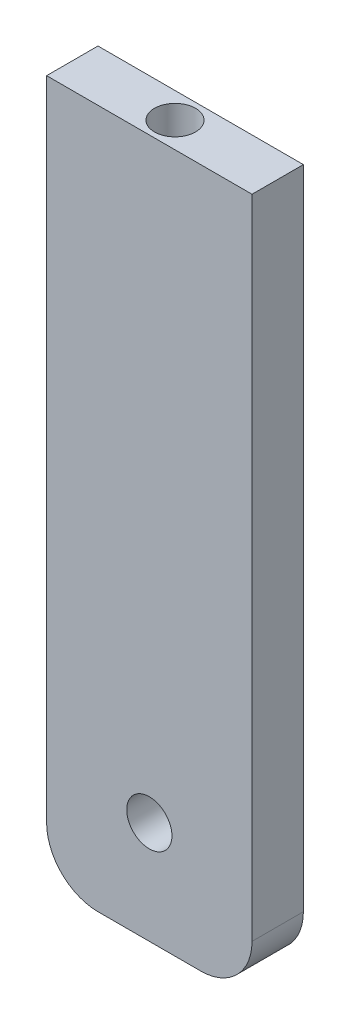
ISO-10303-21;
HEADER;
FILE_DESCRIPTION(('STEP AP214'),'2;1');
FILE_NAME('part.step','',(''),(''),'','','');
FILE_SCHEMA(('AUTOMOTIVE_DESIGN { 1 0 10303 214 1 1 1 1 }'));
ENDSEC;
DATA;
#1=APPLICATION_CONTEXT('core data for automotive mechanical design processes');
#2=APPLICATION_PROTOCOL_DEFINITION('international standard','automotive_design',2000,#1);
#3=PRODUCT_CONTEXT('',#1,'mechanical');
#4=PRODUCT('Part','Part','',(#3));
#5=PRODUCT_RELATED_PRODUCT_CATEGORY('part','',(#4));
#6=PRODUCT_DEFINITION_FORMATION('','',#4);
#7=PRODUCT_DEFINITION_CONTEXT('part definition',#1,'design');
#8=PRODUCT_DEFINITION('design','',#6,#7);
#9=PRODUCT_DEFINITION_SHAPE('','',#8);
#10=(LENGTH_UNIT() NAMED_UNIT(*) SI_UNIT(.MILLI.,.METRE.));
#11=(NAMED_UNIT(*) PLANE_ANGLE_UNIT() SI_UNIT($,.RADIAN.));
#12=(NAMED_UNIT(*) SI_UNIT($,.STERADIAN.) SOLID_ANGLE_UNIT());
#13=UNCERTAINTY_MEASURE_WITH_UNIT(LENGTH_MEASURE(1.E-05),#10,'distance_accuracy_value','');
#14=(GEOMETRIC_REPRESENTATION_CONTEXT(3) GLOBAL_UNCERTAINTY_ASSIGNED_CONTEXT((#13)) GLOBAL_UNIT_ASSIGNED_CONTEXT((#10,
#11,#12)) REPRESENTATION_CONTEXT('',''));
#15=CARTESIAN_POINT('',(0.,0.,0.));
#16=DIRECTION('',(0.,0.,1.));
#17=DIRECTION('',(1.,0.,0.));
#18=AXIS2_PLACEMENT_3D('',#15,#16,#17);
#19=CARTESIAN_POINT('',(0.,0.,5.));
#20=DIRECTION('',(0.,0.,-1.));
#21=DIRECTION('',(-1.,0.,0.));
#22=AXIS2_PLACEMENT_3D('',#19,#20,#21);
#23=PLANE('',#22);
#24=DIRECTION('',(0.,-1.,0.));
#25=VECTOR('',#24,1.);
#26=CARTESIAN_POINT('',(0.,0.,5.));
#27=LINE('',#26,#25);
#28=CARTESIAN_POINT('',(0.,68.,5.));
#29=VERTEX_POINT('',#28);
#30=CARTESIAN_POINT('',(0.,5.,5.));
#31=VERTEX_POINT('',#30);
#32=EDGE_CURVE('E124',#29,#31,#27,.T.);
#33=ORIENTED_EDGE('',*,*,#32,.T.);
#34=CARTESIAN_POINT('',(5.,5.,5.));
#35=DIRECTION('',(0.,0.,-1.));
#36=DIRECTION('',(-1.,0.,0.));
#37=AXIS2_PLACEMENT_3D('',#34,#35,#36);
#38=CIRCLE('',#37,5.);
#39=CARTESIAN_POINT('',(5.,0.,5.));
#40=VERTEX_POINT('',#39);
#41=EDGE_CURVE('E45',#31,#40,#38,.F.);
#42=ORIENTED_EDGE('',*,*,#41,.T.);
#43=DIRECTION('',(1.,0.,0.));
#44=VECTOR('',#43,1.);
#45=CARTESIAN_POINT('',(0.,0.,5.));
#46=LINE('',#45,#44);
#47=CARTESIAN_POINT('',(15.,0.,5.));
#48=VERTEX_POINT('',#47);
#49=EDGE_CURVE('E98',#40,#48,#46,.T.);
#50=ORIENTED_EDGE('',*,*,#49,.T.);
#51=CARTESIAN_POINT('',(15.,5.,5.));
#52=DIRECTION('',(0.,0.,-1.));
#53=DIRECTION('',(-1.,0.,0.));
#54=AXIS2_PLACEMENT_3D('',#51,#52,#53);
#55=CIRCLE('',#54,5.);
#56=CARTESIAN_POINT('',(20.,5.,5.));
#57=VERTEX_POINT('',#56);
#58=EDGE_CURVE('E52',#48,#57,#55,.F.);
#59=ORIENTED_EDGE('',*,*,#58,.T.);
#60=DIRECTION('',(0.,1.,0.));
#61=VECTOR('',#60,1.);
#62=CARTESIAN_POINT('',(20.,68.,5.));
#63=LINE('',#62,#61);
#64=CARTESIAN_POINT('',(20.,68.,5.));
#65=VERTEX_POINT('',#64);
#66=EDGE_CURVE('E90',#57,#65,#63,.T.);
#67=ORIENTED_EDGE('',*,*,#66,.T.);
#68=DIRECTION('',(-1.,0.,0.));
#69=VECTOR('',#68,1.);
#70=CARTESIAN_POINT('',(0.,68.,5.));
#71=LINE('',#70,#69);
#72=EDGE_CURVE('E94',#65,#29,#71,.T.);
#73=ORIENTED_EDGE('',*,*,#72,.T.);
#74=EDGE_LOOP('',(#33,#42,#50,#59,#67,#73));
#75=FACE_BOUND('',#74,.T.);
#76=CARTESIAN_POINT('',(10.,10.,5.));
#77=DIRECTION('',(0.,0.,1.));
#78=DIRECTION('',(1.,0.,0.));
#79=AXIS2_PLACEMENT_3D('',#76,#77,#78);
#80=CIRCLE('',#79,2.2);
#81=CARTESIAN_POINT('',(12.2,10.,5.));
#82=VERTEX_POINT('',#81);
#83=EDGE_CURVE('E119',#82,#82,#80,.T.);
#84=ORIENTED_EDGE('',*,*,#83,.F.);
#85=EDGE_LOOP('',(#84));
#86=FACE_BOUND('',#85,.T.);
#87=ADVANCED_FACE('F37',(#75,#86),#23,.F.);
#88=CARTESIAN_POINT('',(0.,0.,0.));
#89=DIRECTION('',(0.,0.,-1.));
#90=DIRECTION('',(-1.,0.,0.));
#91=AXIS2_PLACEMENT_3D('',#88,#89,#90);
#92=PLANE('',#91);
#93=DIRECTION('',(1.,0.,0.));
#94=VECTOR('',#93,1.);
#95=CARTESIAN_POINT('',(0.,0.,0.));
#96=LINE('',#95,#94);
#97=CARTESIAN_POINT('',(5.,0.,0.));
#98=VERTEX_POINT('',#97);
#99=CARTESIAN_POINT('',(15.,0.,0.));
#100=VERTEX_POINT('',#99);
#101=EDGE_CURVE('E118',#98,#100,#96,.T.);
#102=ORIENTED_EDGE('',*,*,#101,.F.);
#103=CARTESIAN_POINT('',(5.,5.,0.));
#104=DIRECTION('',(0.,0.,-1.));
#105=DIRECTION('',(-1.,0.,0.));
#106=AXIS2_PLACEMENT_3D('',#103,#104,#105);
#107=CIRCLE('',#106,5.);
#108=CARTESIAN_POINT('',(0.,5.,0.));
#109=VERTEX_POINT('',#108);
#110=EDGE_CURVE('E132',#98,#109,#107,.T.);
#111=ORIENTED_EDGE('',*,*,#110,.T.);
#112=DIRECTION('',(0.,-1.,0.));
#113=VECTOR('',#112,1.);
#114=CARTESIAN_POINT('',(0.,0.,0.));
#115=LINE('',#114,#113);
#116=CARTESIAN_POINT('',(0.,68.,0.));
#117=VERTEX_POINT('',#116);
#118=EDGE_CURVE('E116',#117,#109,#115,.T.);
#119=ORIENTED_EDGE('',*,*,#118,.F.);
#120=DIRECTION('',(-1.,0.,0.));
#121=VECTOR('',#120,1.);
#122=CARTESIAN_POINT('',(0.,68.,0.));
#123=LINE('',#122,#121);
#124=CARTESIAN_POINT('',(20.,68.,0.));
#125=VERTEX_POINT('',#124);
#126=EDGE_CURVE('E123',#125,#117,#123,.T.);
#127=ORIENTED_EDGE('',*,*,#126,.F.);
#128=DIRECTION('',(0.,1.,0.));
#129=VECTOR('',#128,1.);
#130=CARTESIAN_POINT('',(20.,68.,0.));
#131=LINE('',#130,#129);
#132=CARTESIAN_POINT('',(20.,5.,0.));
#133=VERTEX_POINT('',#132);
#134=EDGE_CURVE('E104',#133,#125,#131,.T.);
#135=ORIENTED_EDGE('',*,*,#134,.F.);
#136=CARTESIAN_POINT('',(15.,5.,0.));
#137=DIRECTION('',(0.,0.,-1.));
#138=DIRECTION('',(-1.,0.,0.));
#139=AXIS2_PLACEMENT_3D('',#136,#137,#138);
#140=CIRCLE('',#139,5.);
#141=EDGE_CURVE('E130',#133,#100,#140,.T.);
#142=ORIENTED_EDGE('',*,*,#141,.T.);
#143=EDGE_LOOP('',(#102,#111,#119,#127,#135,#142));
#144=FACE_BOUND('',#143,.T.);
#145=CARTESIAN_POINT('',(10.,10.,0.));
#146=DIRECTION('',(0.,0.,1.));
#147=DIRECTION('',(1.,0.,0.));
#148=AXIS2_PLACEMENT_3D('',#145,#146,#147);
#149=CIRCLE('',#148,2.2);
#150=CARTESIAN_POINT('',(12.2,10.,0.));
#151=VERTEX_POINT('',#150);
#152=EDGE_CURVE('E151',#151,#151,#149,.T.);
#153=ORIENTED_EDGE('',*,*,#152,.T.);
#154=EDGE_LOOP('',(#153));
#155=FACE_BOUND('',#154,.T.);
#156=ADVANCED_FACE('F146',(#144,#155),#92,.T.);
#157=CARTESIAN_POINT('',(0.,0.,5.));
#158=DIRECTION('',(1.,0.,0.));
#159=DIRECTION('',(0.,0.,-1.));
#160=AXIS2_PLACEMENT_3D('',#157,#158,#159);
#161=PLANE('',#160);
#162=ORIENTED_EDGE('',*,*,#118,.T.);
#163=DIRECTION('',(0.,0.,-1.));
#164=VECTOR('',#163,1.);
#165=CARTESIAN_POINT('',(0.,5.,5.));
#166=LINE('',#165,#164);
#167=EDGE_CURVE('E60',#109,#31,#166,.F.);
#168=ORIENTED_EDGE('',*,*,#167,.T.);
#169=ORIENTED_EDGE('',*,*,#32,.F.);
#170=DIRECTION('',(0.,0.,-1.));
#171=VECTOR('',#170,1.);
#172=CARTESIAN_POINT('',(0.,68.,5.));
#173=LINE('',#172,#171);
#174=EDGE_CURVE('E108',#29,#117,#173,.T.);
#175=ORIENTED_EDGE('',*,*,#174,.T.);
#176=EDGE_LOOP('',(#162,#168,#169,#175));
#177=FACE_BOUND('',#176,.T.);
#178=ADVANCED_FACE('F148',(#177),#161,.F.);
#179=CARTESIAN_POINT('',(0.,0.,5.));
#180=DIRECTION('',(0.,1.,0.));
#181=DIRECTION('',(0.,0.,1.));
#182=AXIS2_PLACEMENT_3D('',#179,#180,#181);
#183=PLANE('',#182);
#184=ORIENTED_EDGE('',*,*,#49,.F.);
#185=DIRECTION('',(0.,0.,-1.));
#186=VECTOR('',#185,1.);
#187=CARTESIAN_POINT('',(5.,0.,5.));
#188=LINE('',#187,#186);
#189=EDGE_CURVE('E127',#40,#98,#188,.T.);
#190=ORIENTED_EDGE('',*,*,#189,.T.);
#191=ORIENTED_EDGE('',*,*,#101,.T.);
#192=DIRECTION('',(0.,0.,-1.));
#193=VECTOR('',#192,1.);
#194=CARTESIAN_POINT('',(15.,0.,5.));
#195=LINE('',#194,#193);
#196=EDGE_CURVE('E107',#100,#48,#195,.F.);
#197=ORIENTED_EDGE('',*,*,#196,.T.);
#198=EDGE_LOOP('',(#184,#190,#191,#197));
#199=FACE_BOUND('',#198,.T.);
#200=ADVANCED_FACE('F140',(#199),#183,.F.);
#201=CARTESIAN_POINT('',(20.,68.,5.));
#202=DIRECTION('',(-1.,0.,0.));
#203=DIRECTION('',(0.,0.,1.));
#204=AXIS2_PLACEMENT_3D('',#201,#202,#203);
#205=PLANE('',#204);
#206=ORIENTED_EDGE('',*,*,#66,.F.);
#207=DIRECTION('',(0.,0.,-1.));
#208=VECTOR('',#207,1.);
#209=CARTESIAN_POINT('',(20.,5.,5.));
#210=LINE('',#209,#208);
#211=EDGE_CURVE('E11',#57,#133,#210,.T.);
#212=ORIENTED_EDGE('',*,*,#211,.T.);
#213=ORIENTED_EDGE('',*,*,#134,.T.);
#214=DIRECTION('',(0.,0.,-1.));
#215=VECTOR('',#214,1.);
#216=CARTESIAN_POINT('',(20.,68.,5.));
#217=LINE('',#216,#215);
#218=EDGE_CURVE('E101',#65,#125,#217,.T.);
#219=ORIENTED_EDGE('',*,*,#218,.F.);
#220=EDGE_LOOP('',(#206,#212,#213,#219));
#221=FACE_BOUND('',#220,.T.);
#222=ADVANCED_FACE('F102',(#221),#205,.F.);
#223=CARTESIAN_POINT('',(0.,68.,5.));
#224=DIRECTION('',(0.,-1.,0.));
#225=DIRECTION('',(0.,0.,-1.));
#226=AXIS2_PLACEMENT_3D('',#223,#224,#225);
#227=PLANE('',#226);
#228=CARTESIAN_POINT('',(10.,68.,2.5));
#229=DIRECTION('',(0.,1.,0.));
#230=DIRECTION('',(0.,0.,1.));
#231=AXIS2_PLACEMENT_3D('',#228,#229,#230);
#232=CIRCLE('',#231,2.);
#233=CARTESIAN_POINT('',(10.,68.,4.5));
#234=VERTEX_POINT('',#233);
#235=EDGE_CURVE('E157',#234,#234,#232,.T.);
#236=ORIENTED_EDGE('',*,*,#235,.F.);
#237=EDGE_LOOP('',(#236));
#238=FACE_BOUND('',#237,.T.);
#239=ORIENTED_EDGE('',*,*,#126,.T.);
#240=ORIENTED_EDGE('',*,*,#174,.F.);
#241=ORIENTED_EDGE('',*,*,#72,.F.);
#242=ORIENTED_EDGE('',*,*,#218,.T.);
#243=EDGE_LOOP('',(#239,#240,#241,#242));
#244=FACE_BOUND('',#243,.T.);
#245=ADVANCED_FACE('F110',(#238,#244),#227,.F.);
#246=CARTESIAN_POINT('',(10.,10.,5.));
#247=DIRECTION('',(0.,0.,-1.));
#248=DIRECTION('',(-1.,0.,0.));
#249=AXIS2_PLACEMENT_3D('',#246,#247,#248);
#250=CYLINDRICAL_SURFACE('',#249,2.2);
#251=ORIENTED_EDGE('',*,*,#83,.T.);
#252=EDGE_LOOP('',(#251));
#253=FACE_BOUND('',#252,.T.);
#254=ORIENTED_EDGE('',*,*,#152,.F.);
#255=EDGE_LOOP('',(#254));
#256=FACE_BOUND('',#255,.T.);
#257=ADVANCED_FACE('F172',(#253,#256),#250,.F.);
#258=CARTESIAN_POINT('',(5.,5.,5.));
#259=DIRECTION('',(0.,0.,-1.));
#260=DIRECTION('',(-1.,0.,0.));
#261=AXIS2_PLACEMENT_3D('',#258,#259,#260);
#262=CYLINDRICAL_SURFACE('',#261,5.);
#263=ORIENTED_EDGE('',*,*,#41,.F.);
#264=ORIENTED_EDGE('',*,*,#167,.F.);
#265=ORIENTED_EDGE('',*,*,#110,.F.);
#266=ORIENTED_EDGE('',*,*,#189,.F.);
#267=EDGE_LOOP('',(#263,#264,#265,#266));
#268=FACE_BOUND('',#267,.T.);
#269=ADVANCED_FACE('F143',(#268),#262,.T.);
#270=CARTESIAN_POINT('',(15.,5.,5.));
#271=DIRECTION('',(0.,0.,-1.));
#272=DIRECTION('',(-1.,0.,0.));
#273=AXIS2_PLACEMENT_3D('',#270,#271,#272);
#274=CYLINDRICAL_SURFACE('',#273,5.);
#275=ORIENTED_EDGE('',*,*,#58,.F.);
#276=ORIENTED_EDGE('',*,*,#196,.F.);
#277=ORIENTED_EDGE('',*,*,#141,.F.);
#278=ORIENTED_EDGE('',*,*,#211,.F.);
#279=EDGE_LOOP('',(#275,#276,#277,#278));
#280=FACE_BOUND('',#279,.T.);
#281=ADVANCED_FACE('F39',(#280),#274,.T.);
#282=CARTESIAN_POINT('',(10.,58.,2.5));
#283=DIRECTION('',(0.,1.,0.));
#284=DIRECTION('',(0.,0.,1.));
#285=AXIS2_PLACEMENT_3D('',#282,#283,#284);
#286=CYLINDRICAL_SURFACE('',#285,2.);
#287=CARTESIAN_POINT('',(10.,58.,2.5));
#288=DIRECTION('',(0.,1.,0.));
#289=DIRECTION('',(0.,0.,1.));
#290=AXIS2_PLACEMENT_3D('',#287,#288,#289);
#291=CIRCLE('',#290,2.);
#292=CARTESIAN_POINT('',(10.,58.,4.5));
#293=VERTEX_POINT('',#292);
#294=EDGE_CURVE('E154',#293,#293,#291,.T.);
#295=ORIENTED_EDGE('',*,*,#294,.F.);
#296=EDGE_LOOP('',(#295));
#297=FACE_BOUND('',#296,.T.);
#298=ORIENTED_EDGE('',*,*,#235,.T.);
#299=EDGE_LOOP('',(#298));
#300=FACE_BOUND('',#299,.T.);
#301=ADVANCED_FACE('F165',(#297,#300),#286,.F.);
#302=CARTESIAN_POINT('',(10.,58.,2.5));
#303=DIRECTION('',(0.,1.,0.));
#304=DIRECTION('',(0.,0.,1.));
#305=AXIS2_PLACEMENT_3D('',#302,#303,#304);
#306=PLANE('',#305);
#307=ORIENTED_EDGE('',*,*,#294,.T.);
#308=EDGE_LOOP('',(#307));
#309=FACE_BOUND('',#308,.T.);
#310=ADVANCED_FACE('F163',(#309),#306,.T.);
#311=CLOSED_SHELL('',(#87,#156,#178,#200,#222,#245,#257,#269,#281,#301,#310));
#312=MANIFOLD_SOLID_BREP('B2',#311);
#313=ADVANCED_BREP_SHAPE_REPRESENTATION('',(#18,#312),#14);
#314=SHAPE_DEFINITION_REPRESENTATION(#9,#313);
ENDSEC;
END-ISO-10303-21;
